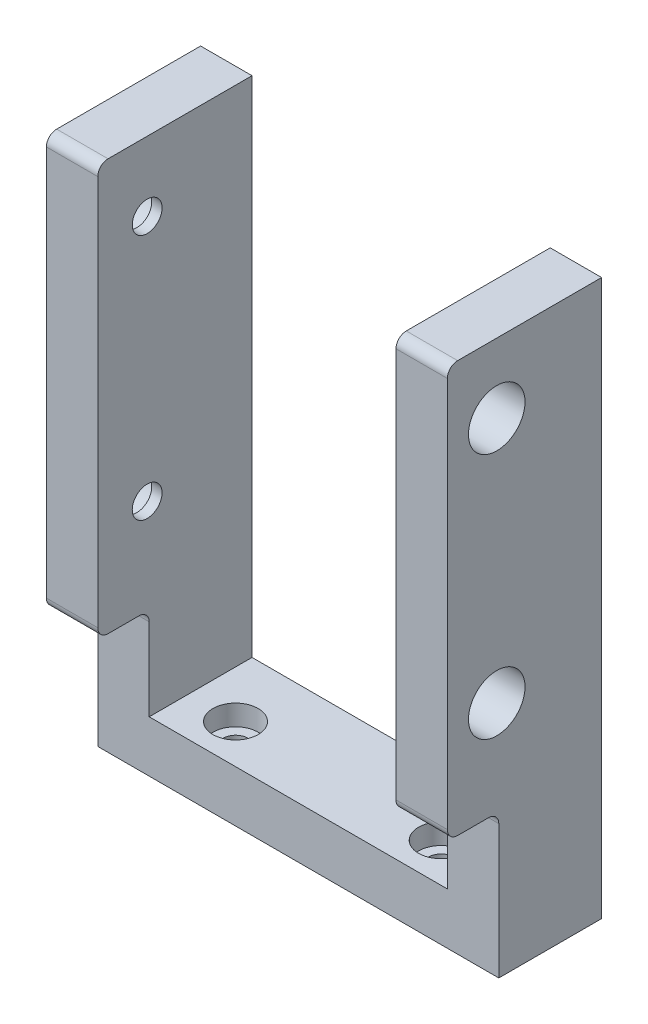
ISO-10303-21;
HEADER;
FILE_DESCRIPTION(('STEP AP214'),'2;1');
FILE_NAME('part.step','',(''),(''),'','','');
FILE_SCHEMA(('AUTOMOTIVE_DESIGN { 1 0 10303 214 1 1 1 1 }'));
ENDSEC;
DATA;
#1=APPLICATION_CONTEXT('core data for automotive mechanical design processes');
#2=APPLICATION_PROTOCOL_DEFINITION('international standard','automotive_design',2000,#1);
#3=PRODUCT_CONTEXT('',#1,'mechanical');
#4=PRODUCT('Part','Part','',(#3));
#5=PRODUCT_RELATED_PRODUCT_CATEGORY('part','',(#4));
#6=PRODUCT_DEFINITION_FORMATION('','',#4);
#7=PRODUCT_DEFINITION_CONTEXT('part definition',#1,'design');
#8=PRODUCT_DEFINITION('design','',#6,#7);
#9=PRODUCT_DEFINITION_SHAPE('','',#8);
#10=(LENGTH_UNIT() NAMED_UNIT(*) SI_UNIT(.MILLI.,.METRE.));
#11=(NAMED_UNIT(*) PLANE_ANGLE_UNIT() SI_UNIT($,.RADIAN.));
#12=(NAMED_UNIT(*) SI_UNIT($,.STERADIAN.) SOLID_ANGLE_UNIT());
#13=UNCERTAINTY_MEASURE_WITH_UNIT(LENGTH_MEASURE(1.E-05),#10,'distance_accuracy_value','');
#14=(GEOMETRIC_REPRESENTATION_CONTEXT(3) GLOBAL_UNCERTAINTY_ASSIGNED_CONTEXT((#13)) GLOBAL_UNIT_ASSIGNED_CONTEXT((#10,
#11,#12)) REPRESENTATION_CONTEXT('',''));
#15=CARTESIAN_POINT('',(0.,0.,0.));
#16=DIRECTION('',(0.,0.,1.));
#17=DIRECTION('',(1.,0.,0.));
#18=AXIS2_PLACEMENT_3D('',#15,#16,#17);
#19=CARTESIAN_POINT('',(34.,-5.,10.));
#20=DIRECTION('',(-1.,0.,0.));
#21=DIRECTION('',(0.,0.,1.));
#22=AXIS2_PLACEMENT_3D('',#19,#20,#21);
#23=PLANE('',#22);
#24=CARTESIAN_POINT('',(34.,42.250000000001,10.2000000000012));
#25=DIRECTION('',(1.,0.,0.));
#26=DIRECTION('',(0.,0.,-1.));
#27=AXIS2_PLACEMENT_3D('',#24,#25,#26);
#28=CIRCLE('',#27,2.75);
#29=CARTESIAN_POINT('',(34.,42.250000000001,7.45000000000116));
#30=VERTEX_POINT('',#29);
#31=EDGE_CURVE('E770',#30,#30,#28,.T.);
#32=ORIENTED_EDGE('',*,*,#31,.F.);
#33=EDGE_LOOP('',(#32));
#34=FACE_BOUND('',#33,.T.);
#35=DIRECTION('',(0.,-1.,0.));
#36=VECTOR('',#35,1.);
#37=CARTESIAN_POINT('',(34.,49.,15.));
#38=LINE('',#37,#36);
#39=CARTESIAN_POINT('',(34.,48.,15.));
#40=VERTEX_POINT('',#39);
#41=CARTESIAN_POINT('',(34.,9.99999999999999,15.));
#42=VERTEX_POINT('',#41);
#43=EDGE_CURVE('E320',#40,#42,#38,.T.);
#44=ORIENTED_EDGE('',*,*,#43,.T.);
#45=CARTESIAN_POINT('',(34.,9.99999999999999,14.));
#46=DIRECTION('',(-1.,0.,0.));
#47=DIRECTION('',(0.,0.,1.));
#48=AXIS2_PLACEMENT_3D('',#45,#46,#47);
#49=CIRCLE('',#48,1.);
#50=CARTESIAN_POINT('',(34.,8.99999999999999,14.));
#51=VERTEX_POINT('',#50);
#52=EDGE_CURVE('E215',#42,#51,#49,.F.);
#53=ORIENTED_EDGE('',*,*,#52,.T.);
#54=DIRECTION('',(0.,0.,-1.));
#55=VECTOR('',#54,1.);
#56=CARTESIAN_POINT('',(34.,8.99999999999999,15.));
#57=LINE('',#56,#55);
#58=CARTESIAN_POINT('',(34.,8.99999999999999,11.));
#59=VERTEX_POINT('',#58);
#60=EDGE_CURVE('E250',#51,#59,#57,.T.);
#61=ORIENTED_EDGE('',*,*,#60,.T.);
#62=CARTESIAN_POINT('',(34.,7.99999999999999,11.));
#63=DIRECTION('',(-1.,0.,0.));
#64=DIRECTION('',(0.,0.,1.));
#65=AXIS2_PLACEMENT_3D('',#62,#63,#64);
#66=CIRCLE('',#65,1.);
#67=CARTESIAN_POINT('',(34.,7.99999999999999,10.));
#68=VERTEX_POINT('',#67);
#69=EDGE_CURVE('E11',#59,#68,#66,.T.);
#70=ORIENTED_EDGE('',*,*,#69,.T.);
#71=DIRECTION('',(0.,1.,0.));
#72=VECTOR('',#71,1.);
#73=CARTESIAN_POINT('',(34.,-5.,10.));
#74=LINE('',#73,#72);
#75=CARTESIAN_POINT('',(34.,-5.,10.));
#76=VERTEX_POINT('',#75);
#77=EDGE_CURVE('E260',#76,#68,#74,.T.);
#78=ORIENTED_EDGE('',*,*,#77,.F.);
#79=DIRECTION('',(0.,0.,-1.));
#80=VECTOR('',#79,1.);
#81=CARTESIAN_POINT('',(34.,-5.,10.));
#82=LINE('',#81,#80);
#83=CARTESIAN_POINT('',(34.,-5.,0.));
#84=VERTEX_POINT('',#83);
#85=EDGE_CURVE('E293',#76,#84,#82,.T.);
#86=ORIENTED_EDGE('',*,*,#85,.T.);
#87=DIRECTION('',(0.,1.,0.));
#88=VECTOR('',#87,1.);
#89=CARTESIAN_POINT('',(34.,-5.,0.));
#90=LINE('',#89,#88);
#91=CARTESIAN_POINT('',(34.,49.,0.));
#92=VERTEX_POINT('',#91);
#93=EDGE_CURVE('E281',#84,#92,#90,.T.);
#94=ORIENTED_EDGE('',*,*,#93,.T.);
#95=DIRECTION('',(0.,0.,-1.));
#96=VECTOR('',#95,1.);
#97=CARTESIAN_POINT('',(34.,49.,10.));
#98=LINE('',#97,#96);
#99=CARTESIAN_POINT('',(34.,49.,14.));
#100=VERTEX_POINT('',#99);
#101=EDGE_CURVE('E291',#100,#92,#98,.T.);
#102=ORIENTED_EDGE('',*,*,#101,.F.);
#103=CARTESIAN_POINT('',(34.,48.,14.));
#104=DIRECTION('',(-1.,0.,0.));
#105=DIRECTION('',(0.,0.,1.));
#106=AXIS2_PLACEMENT_3D('',#103,#104,#105);
#107=CIRCLE('',#106,1.);
#108=EDGE_CURVE('E213',#100,#40,#107,.F.);
#109=ORIENTED_EDGE('',*,*,#108,.T.);
#110=EDGE_LOOP('',(#44,#53,#61,#70,#78,#86,#94,#102,#109));
#111=FACE_BOUND('',#110,.T.);
#112=CARTESIAN_POINT('',(34.,18.250000000001,10.2000000000012));
#113=DIRECTION('',(1.,0.,0.));
#114=DIRECTION('',(0.,0.,-1.));
#115=AXIS2_PLACEMENT_3D('',#112,#113,#114);
#116=CIRCLE('',#115,2.75);
#117=CARTESIAN_POINT('',(34.,18.250000000001,7.45000000000117));
#118=VERTEX_POINT('',#117);
#119=EDGE_CURVE('E760',#118,#118,#116,.T.);
#120=ORIENTED_EDGE('',*,*,#119,.F.);
#121=EDGE_LOOP('',(#120));
#122=FACE_BOUND('',#121,.T.);
#123=ADVANCED_FACE('F33',(#34,#111,#122),#23,.F.);
#124=CARTESIAN_POINT('',(0.,0.,10.));
#125=DIRECTION('',(0.,0.,-1.));
#126=DIRECTION('',(-1.,0.,0.));
#127=AXIS2_PLACEMENT_3D('',#124,#125,#126);
#128=PLANE('',#127);
#129=DIRECTION('',(0.,1.,0.));
#130=VECTOR('',#129,1.);
#131=CARTESIAN_POINT('',(0.,0.,10.));
#132=LINE('',#131,#130);
#133=CARTESIAN_POINT('',(0.,0.,10.));
#134=VERTEX_POINT('',#133);
#135=CARTESIAN_POINT('',(0.,7.99999999999999,10.));
#136=VERTEX_POINT('',#135);
#137=EDGE_CURVE('E157',#134,#136,#132,.T.);
#138=ORIENTED_EDGE('',*,*,#137,.T.);
#139=DIRECTION('',(1.,0.,0.));
#140=VECTOR('',#139,1.);
#141=CARTESIAN_POINT('',(-5.,7.99999999999999,10.));
#142=LINE('',#141,#140);
#143=CARTESIAN_POINT('',(-5.,7.99999999999999,10.));
#144=VERTEX_POINT('',#143);
#145=EDGE_CURVE('E198',#136,#144,#142,.F.);
#146=ORIENTED_EDGE('',*,*,#145,.T.);
#147=DIRECTION('',(0.,-1.,0.));
#148=VECTOR('',#147,1.);
#149=CARTESIAN_POINT('',(-5.,49.,10.));
#150=LINE('',#149,#148);
#151=CARTESIAN_POINT('',(-5.,-5.,10.));
#152=VERTEX_POINT('',#151);
#153=EDGE_CURVE('E169',#144,#152,#150,.T.);
#154=ORIENTED_EDGE('',*,*,#153,.T.);
#155=DIRECTION('',(1.,0.,0.));
#156=VECTOR('',#155,1.);
#157=CARTESIAN_POINT('',(-5.,-5.,10.));
#158=LINE('',#157,#156);
#159=EDGE_CURVE('E262',#152,#76,#158,.T.);
#160=ORIENTED_EDGE('',*,*,#159,.T.);
#161=ORIENTED_EDGE('',*,*,#77,.T.);
#162=DIRECTION('',(-1.,0.,0.));
#163=VECTOR('',#162,1.);
#164=CARTESIAN_POINT('',(0.,7.99999999999999,10.));
#165=LINE('',#164,#163);
#166=CARTESIAN_POINT('',(29.,7.99999999999999,10.));
#167=VERTEX_POINT('',#166);
#168=EDGE_CURVE('E196',#68,#167,#165,.T.);
#169=ORIENTED_EDGE('',*,*,#168,.T.);
#170=DIRECTION('',(0.,-1.,0.));
#171=VECTOR('',#170,1.);
#172=CARTESIAN_POINT('',(29.,49.,10.));
#173=LINE('',#172,#171);
#174=CARTESIAN_POINT('',(29.,0.,10.));
#175=VERTEX_POINT('',#174);
#176=EDGE_CURVE('E176',#167,#175,#173,.T.);
#177=ORIENTED_EDGE('',*,*,#176,.T.);
#178=DIRECTION('',(-1.,0.,0.));
#179=VECTOR('',#178,1.);
#180=CARTESIAN_POINT('',(29.,0.,10.));
#181=LINE('',#180,#179);
#182=EDGE_CURVE('E170',#175,#134,#181,.T.);
#183=ORIENTED_EDGE('',*,*,#182,.T.);
#184=EDGE_LOOP('',(#138,#146,#154,#160,#161,#169,#177,#183));
#185=FACE_BOUND('',#184,.T.);
#186=ADVANCED_FACE('F173',(#185),#128,.F.);
#187=CARTESIAN_POINT('',(29.,0.,10.));
#188=DIRECTION('',(0.,-1.,0.));
#189=DIRECTION('',(1.,0.,0.));
#190=AXIS2_PLACEMENT_3D('',#187,#188,#189);
#191=PLANE('',#190);
#192=CARTESIAN_POINT('',(24.595625560426,0.,6.2000000000436));
#193=DIRECTION('',(0.,1.,0.));
#194=DIRECTION('',(0.,0.,1.));
#195=AXIS2_PLACEMENT_3D('',#192,#193,#194);
#196=CIRCLE('',#195,2.2);
#197=CARTESIAN_POINT('',(24.595625560426,0.,8.4000000000436));
#198=VERTEX_POINT('',#197);
#199=EDGE_CURVE('E717',#198,#198,#196,.T.);
#200=ORIENTED_EDGE('',*,*,#199,.F.);
#201=EDGE_LOOP('',(#200));
#202=FACE_BOUND('',#201,.T.);
#203=CARTESIAN_POINT('',(4.59562556042595,0.,6.20000000004366));
#204=DIRECTION('',(0.,1.,0.));
#205=DIRECTION('',(0.,0.,1.));
#206=AXIS2_PLACEMENT_3D('',#203,#204,#205);
#207=CIRCLE('',#206,2.2);
#208=CARTESIAN_POINT('',(4.59562556042595,0.,8.40000000004366));
#209=VERTEX_POINT('',#208);
#210=EDGE_CURVE('E736',#209,#209,#207,.T.);
#211=ORIENTED_EDGE('',*,*,#210,.F.);
#212=EDGE_LOOP('',(#211));
#213=FACE_BOUND('',#212,.T.);
#214=DIRECTION('',(-1.,0.,0.));
#215=VECTOR('',#214,1.);
#216=CARTESIAN_POINT('',(29.,0.,0.));
#217=LINE('',#216,#215);
#218=CARTESIAN_POINT('',(29.,0.,0.));
#219=VERTEX_POINT('',#218);
#220=CARTESIAN_POINT('',(0.,0.,0.));
#221=VERTEX_POINT('',#220);
#222=EDGE_CURVE('E184',#219,#221,#217,.T.);
#223=ORIENTED_EDGE('',*,*,#222,.T.);
#224=DIRECTION('',(0.,0.,-1.));
#225=VECTOR('',#224,1.);
#226=CARTESIAN_POINT('',(0.,0.,10.));
#227=LINE('',#226,#225);
#228=EDGE_CURVE('E163',#134,#221,#227,.T.);
#229=ORIENTED_EDGE('',*,*,#228,.F.);
#230=ORIENTED_EDGE('',*,*,#182,.F.);
#231=DIRECTION('',(0.,0.,-1.));
#232=VECTOR('',#231,1.);
#233=CARTESIAN_POINT('',(29.,0.,10.));
#234=LINE('',#233,#232);
#235=EDGE_CURVE('E265',#175,#219,#234,.T.);
#236=ORIENTED_EDGE('',*,*,#235,.T.);
#237=EDGE_LOOP('',(#223,#229,#230,#236));
#238=FACE_BOUND('',#237,.T.);
#239=ADVANCED_FACE('F182',(#202,#213,#238),#191,.F.);
#240=CARTESIAN_POINT('',(0.,0.,10.));
#241=DIRECTION('',(-1.,0.,0.));
#242=DIRECTION('',(0.,0.,1.));
#243=AXIS2_PLACEMENT_3D('',#240,#241,#242);
#244=PLANE('',#243);
#245=CARTESIAN_POINT('',(0.,42.250000000001,10.2000000000012));
#246=DIRECTION('',(-1.,0.,0.));
#247=DIRECTION('',(0.,0.,1.));
#248=AXIS2_PLACEMENT_3D('',#245,#246,#247);
#249=CIRCLE('',#248,1.45);
#250=CARTESIAN_POINT('',(0.,42.250000000001,11.6500000000012));
#251=VERTEX_POINT('',#250);
#252=EDGE_CURVE('E785',#251,#251,#249,.T.);
#253=ORIENTED_EDGE('',*,*,#252,.T.);
#254=EDGE_LOOP('',(#253));
#255=FACE_BOUND('',#254,.T.);
#256=CARTESIAN_POINT('',(0.,18.250000000001,10.2000000000013));
#257=DIRECTION('',(-1.,0.,0.));
#258=DIRECTION('',(0.,0.,1.));
#259=AXIS2_PLACEMENT_3D('',#256,#257,#258);
#260=CIRCLE('',#259,1.45);
#261=CARTESIAN_POINT('',(0.,18.250000000001,11.6500000000013));
#262=VERTEX_POINT('',#261);
#263=EDGE_CURVE('E773',#262,#262,#260,.T.);
#264=ORIENTED_EDGE('',*,*,#263,.T.);
#265=EDGE_LOOP('',(#264));
#266=FACE_BOUND('',#265,.T.);
#267=DIRECTION('',(0.,1.,0.));
#268=VECTOR('',#267,1.);
#269=CARTESIAN_POINT('',(0.,49.,15.));
#270=LINE('',#269,#268);
#271=CARTESIAN_POINT('',(0.,9.99999999999999,15.));
#272=VERTEX_POINT('',#271);
#273=CARTESIAN_POINT('',(0.,48.,15.));
#274=VERTEX_POINT('',#273);
#275=EDGE_CURVE('E339',#272,#274,#270,.T.);
#276=ORIENTED_EDGE('',*,*,#275,.F.);
#277=CARTESIAN_POINT('',(0.,9.99999999999999,14.));
#278=DIRECTION('',(-1.,0.,0.));
#279=DIRECTION('',(0.,0.,1.));
#280=AXIS2_PLACEMENT_3D('',#277,#278,#279);
#281=CIRCLE('',#280,1.);
#282=CARTESIAN_POINT('',(0.,8.99999999999999,14.));
#283=VERTEX_POINT('',#282);
#284=EDGE_CURVE('E225',#272,#283,#281,.F.);
#285=ORIENTED_EDGE('',*,*,#284,.T.);
#286=DIRECTION('',(0.,0.,-1.));
#287=VECTOR('',#286,1.);
#288=CARTESIAN_POINT('',(0.,8.99999999999999,15.));
#289=LINE('',#288,#287);
#290=CARTESIAN_POINT('',(0.,8.99999999999999,11.));
#291=VERTEX_POINT('',#290);
#292=EDGE_CURVE('E342',#283,#291,#289,.T.);
#293=ORIENTED_EDGE('',*,*,#292,.T.);
#294=CARTESIAN_POINT('',(0.,7.99999999999999,11.));
#295=DIRECTION('',(-1.,0.,0.));
#296=DIRECTION('',(0.,0.,1.));
#297=AXIS2_PLACEMENT_3D('',#294,#295,#296);
#298=CIRCLE('',#297,1.);
#299=EDGE_CURVE('E166',#291,#136,#298,.T.);
#300=ORIENTED_EDGE('',*,*,#299,.T.);
#301=ORIENTED_EDGE('',*,*,#137,.F.);
#302=ORIENTED_EDGE('',*,*,#228,.T.);
#303=DIRECTION('',(0.,1.,0.));
#304=VECTOR('',#303,1.);
#305=CARTESIAN_POINT('',(0.,0.,0.));
#306=LINE('',#305,#304);
#307=CARTESIAN_POINT('',(0.,49.,0.));
#308=VERTEX_POINT('',#307);
#309=EDGE_CURVE('E271',#221,#308,#306,.T.);
#310=ORIENTED_EDGE('',*,*,#309,.T.);
#311=DIRECTION('',(0.,0.,-1.));
#312=VECTOR('',#311,1.);
#313=CARTESIAN_POINT('',(0.,49.,10.));
#314=LINE('',#313,#312);
#315=CARTESIAN_POINT('',(0.,49.,14.));
#316=VERTEX_POINT('',#315);
#317=EDGE_CURVE('E186',#316,#308,#314,.T.);
#318=ORIENTED_EDGE('',*,*,#317,.F.);
#319=CARTESIAN_POINT('',(0.,48.,14.));
#320=DIRECTION('',(-1.,0.,0.));
#321=DIRECTION('',(0.,0.,1.));
#322=AXIS2_PLACEMENT_3D('',#319,#320,#321);
#323=CIRCLE('',#322,1.);
#324=EDGE_CURVE('E223',#316,#274,#323,.F.);
#325=ORIENTED_EDGE('',*,*,#324,.T.);
#326=EDGE_LOOP('',(#276,#285,#293,#300,#301,#302,#310,#318,#325));
#327=FACE_BOUND('',#326,.T.);
#328=ADVANCED_FACE('F160',(#255,#266,#327),#244,.F.);
#329=CARTESIAN_POINT('',(0.,49.,10.));
#330=DIRECTION('',(0.,-1.,0.));
#331=DIRECTION('',(0.,0.,-1.));
#332=AXIS2_PLACEMENT_3D('',#329,#330,#331);
#333=PLANE('',#332);
#334=DIRECTION('',(0.,0.,-1.));
#335=VECTOR('',#334,1.);
#336=CARTESIAN_POINT('',(-5.,49.,10.));
#337=LINE('',#336,#335);
#338=CARTESIAN_POINT('',(-5.,49.,14.));
#339=VERTEX_POINT('',#338);
#340=CARTESIAN_POINT('',(-5.,49.,0.));
#341=VERTEX_POINT('',#340);
#342=EDGE_CURVE('E190',#339,#341,#337,.T.);
#343=ORIENTED_EDGE('',*,*,#342,.F.);
#344=DIRECTION('',(-1.,0.,0.));
#345=VECTOR('',#344,1.);
#346=CARTESIAN_POINT('',(0.,49.,14.));
#347=LINE('',#346,#345);
#348=EDGE_CURVE('E55',#339,#316,#347,.F.);
#349=ORIENTED_EDGE('',*,*,#348,.T.);
#350=ORIENTED_EDGE('',*,*,#317,.T.);
#351=DIRECTION('',(-1.,0.,0.));
#352=VECTOR('',#351,1.);
#353=CARTESIAN_POINT('',(0.,49.,0.));
#354=LINE('',#353,#352);
#355=EDGE_CURVE('E274',#308,#341,#354,.T.);
#356=ORIENTED_EDGE('',*,*,#355,.T.);
#357=EDGE_LOOP('',(#343,#349,#350,#356));
#358=FACE_BOUND('',#357,.T.);
#359=ADVANCED_FACE('F302',(#358),#333,.F.);
#360=CARTESIAN_POINT('',(-5.,49.,10.));
#361=DIRECTION('',(1.,0.,0.));
#362=DIRECTION('',(0.,1.,0.));
#363=AXIS2_PLACEMENT_3D('',#360,#361,#362);
#364=PLANE('',#363);
#365=CARTESIAN_POINT('',(-5.,42.250000000001,10.2000000000012));
#366=DIRECTION('',(-1.,0.,0.));
#367=DIRECTION('',(0.,0.,1.));
#368=AXIS2_PLACEMENT_3D('',#365,#366,#367);
#369=CIRCLE('',#368,2.75);
#370=CARTESIAN_POINT('',(-5.,42.250000000001,12.9500000000012));
#371=VERTEX_POINT('',#370);
#372=EDGE_CURVE('E794',#371,#371,#369,.T.);
#373=ORIENTED_EDGE('',*,*,#372,.F.);
#374=EDGE_LOOP('',(#373));
#375=FACE_BOUND('',#374,.T.);
#376=CARTESIAN_POINT('',(-5.,18.250000000001,10.2000000000013));
#377=DIRECTION('',(-1.,0.,0.));
#378=DIRECTION('',(0.,0.,1.));
#379=AXIS2_PLACEMENT_3D('',#376,#377,#378);
#380=CIRCLE('',#379,2.75);
#381=CARTESIAN_POINT('',(-5.,18.250000000001,12.9500000000012));
#382=VERTEX_POINT('',#381);
#383=EDGE_CURVE('E782',#382,#382,#380,.T.);
#384=ORIENTED_EDGE('',*,*,#383,.F.);
#385=EDGE_LOOP('',(#384));
#386=FACE_BOUND('',#385,.T.);
#387=DIRECTION('',(0.,0.,-1.));
#388=VECTOR('',#387,1.);
#389=CARTESIAN_POINT('',(-5.,8.99999999999999,15.));
#390=LINE('',#389,#388);
#391=CARTESIAN_POINT('',(-5.,8.99999999999999,14.));
#392=VERTEX_POINT('',#391);
#393=CARTESIAN_POINT('',(-5.,8.99999999999999,11.));
#394=VERTEX_POINT('',#393);
#395=EDGE_CURVE('E272',#392,#394,#390,.T.);
#396=ORIENTED_EDGE('',*,*,#395,.F.);
#397=CARTESIAN_POINT('',(-5.,9.99999999999999,14.));
#398=DIRECTION('',(1.,0.,0.));
#399=DIRECTION('',(0.,1.,0.));
#400=AXIS2_PLACEMENT_3D('',#397,#398,#399);
#401=CIRCLE('',#400,1.);
#402=CARTESIAN_POINT('',(-5.,9.99999999999999,15.));
#403=VERTEX_POINT('',#402);
#404=EDGE_CURVE('E228',#392,#403,#401,.F.);
#405=ORIENTED_EDGE('',*,*,#404,.T.);
#406=DIRECTION('',(0.,-1.,0.));
#407=VECTOR('',#406,1.);
#408=CARTESIAN_POINT('',(-5.,49.,15.));
#409=LINE('',#408,#407);
#410=CARTESIAN_POINT('',(-5.,48.,15.));
#411=VERTEX_POINT('',#410);
#412=EDGE_CURVE('E249',#411,#403,#409,.T.);
#413=ORIENTED_EDGE('',*,*,#412,.F.);
#414=CARTESIAN_POINT('',(-5.,48.,14.));
#415=DIRECTION('',(1.,0.,0.));
#416=DIRECTION('',(0.,1.,0.));
#417=AXIS2_PLACEMENT_3D('',#414,#415,#416);
#418=CIRCLE('',#417,1.);
#419=EDGE_CURVE('E48',#411,#339,#418,.F.);
#420=ORIENTED_EDGE('',*,*,#419,.T.);
#421=ORIENTED_EDGE('',*,*,#342,.T.);
#422=DIRECTION('',(0.,-1.,0.));
#423=VECTOR('',#422,1.);
#424=CARTESIAN_POINT('',(-5.,49.,0.));
#425=LINE('',#424,#423);
#426=CARTESIAN_POINT('',(-5.,-5.,0.));
#427=VERTEX_POINT('',#426);
#428=EDGE_CURVE('E277',#341,#427,#425,.T.);
#429=ORIENTED_EDGE('',*,*,#428,.T.);
#430=DIRECTION('',(0.,0.,-1.));
#431=VECTOR('',#430,1.);
#432=CARTESIAN_POINT('',(-5.,-5.,10.));
#433=LINE('',#432,#431);
#434=EDGE_CURVE('E295',#152,#427,#433,.T.);
#435=ORIENTED_EDGE('',*,*,#434,.F.);
#436=ORIENTED_EDGE('',*,*,#153,.F.);
#437=CARTESIAN_POINT('',(-5.,7.99999999999999,11.));
#438=DIRECTION('',(1.,0.,0.));
#439=DIRECTION('',(0.,1.,0.));
#440=AXIS2_PLACEMENT_3D('',#437,#438,#439);
#441=CIRCLE('',#440,1.);
#442=EDGE_CURVE('E235',#144,#394,#441,.T.);
#443=ORIENTED_EDGE('',*,*,#442,.T.);
#444=EDGE_LOOP('',(#396,#405,#413,#420,#421,#429,#435,#436,#443));
#445=FACE_BOUND('',#444,.T.);
#446=ADVANCED_FACE('F298',(#375,#386,#445),#364,.F.);
#447=CARTESIAN_POINT('',(-5.,-5.,10.));
#448=DIRECTION('',(0.,1.,0.));
#449=DIRECTION('',(-1.,0.,0.));
#450=AXIS2_PLACEMENT_3D('',#447,#448,#449);
#451=PLANE('',#450);
#452=CARTESIAN_POINT('',(24.595625560426,-5.,6.2000000000436));
#453=DIRECTION('',(0.,1.,0.));
#454=DIRECTION('',(-1.,0.,0.));
#455=AXIS2_PLACEMENT_3D('',#452,#453,#454);
#456=CIRCLE('',#455,1.2);
#457=CARTESIAN_POINT('',(23.395625560426,-5.,6.2000000000436));
#458=VERTEX_POINT('',#457);
#459=EDGE_CURVE('E733',#458,#458,#456,.T.);
#460=ORIENTED_EDGE('',*,*,#459,.T.);
#461=EDGE_LOOP('',(#460));
#462=FACE_BOUND('',#461,.T.);
#463=CARTESIAN_POINT('',(4.59562556042595,-5.,6.20000000004366));
#464=DIRECTION('',(0.,1.,0.));
#465=DIRECTION('',(-1.,0.,0.));
#466=AXIS2_PLACEMENT_3D('',#463,#464,#465);
#467=CIRCLE('',#466,1.2);
#468=CARTESIAN_POINT('',(3.39562556042596,-5.,6.20000000004366));
#469=VERTEX_POINT('',#468);
#470=EDGE_CURVE('E328',#469,#469,#467,.T.);
#471=ORIENTED_EDGE('',*,*,#470,.T.);
#472=EDGE_LOOP('',(#471));
#473=FACE_BOUND('',#472,.T.);
#474=DIRECTION('',(1.,0.,0.));
#475=VECTOR('',#474,1.);
#476=CARTESIAN_POINT('',(-5.,-5.,0.));
#477=LINE('',#476,#475);
#478=EDGE_CURVE('E279',#427,#84,#477,.T.);
#479=ORIENTED_EDGE('',*,*,#478,.T.);
#480=ORIENTED_EDGE('',*,*,#85,.F.);
#481=ORIENTED_EDGE('',*,*,#159,.F.);
#482=ORIENTED_EDGE('',*,*,#434,.T.);
#483=EDGE_LOOP('',(#479,#480,#481,#482));
#484=FACE_BOUND('',#483,.T.);
#485=ADVANCED_FACE('F309',(#462,#473,#484),#451,.F.);
#486=CARTESIAN_POINT('',(34.,49.,10.));
#487=DIRECTION('',(0.,-1.,0.));
#488=DIRECTION('',(0.,0.,-1.));
#489=AXIS2_PLACEMENT_3D('',#486,#487,#488);
#490=PLANE('',#489);
#491=DIRECTION('',(0.,0.,-1.));
#492=VECTOR('',#491,1.);
#493=CARTESIAN_POINT('',(29.,49.,10.));
#494=LINE('',#493,#492);
#495=CARTESIAN_POINT('',(29.,49.,14.));
#496=VERTEX_POINT('',#495);
#497=CARTESIAN_POINT('',(29.,49.,0.));
#498=VERTEX_POINT('',#497);
#499=EDGE_CURVE('E289',#496,#498,#494,.T.);
#500=ORIENTED_EDGE('',*,*,#499,.F.);
#501=DIRECTION('',(1.,0.,0.));
#502=VECTOR('',#501,1.);
#503=CARTESIAN_POINT('',(34.,49.,14.));
#504=LINE('',#503,#502);
#505=EDGE_CURVE('E231',#496,#100,#504,.T.);
#506=ORIENTED_EDGE('',*,*,#505,.T.);
#507=ORIENTED_EDGE('',*,*,#101,.T.);
#508=DIRECTION('',(-1.,0.,0.));
#509=VECTOR('',#508,1.);
#510=CARTESIAN_POINT('',(34.,49.,0.));
#511=LINE('',#510,#509);
#512=EDGE_CURVE('E284',#92,#498,#511,.T.);
#513=ORIENTED_EDGE('',*,*,#512,.T.);
#514=EDGE_LOOP('',(#500,#506,#507,#513));
#515=FACE_BOUND('',#514,.T.);
#516=ADVANCED_FACE('F314',(#515),#490,.F.);
#517=CARTESIAN_POINT('',(29.,49.,10.));
#518=DIRECTION('',(1.,0.,0.));
#519=DIRECTION('',(0.,1.,0.));
#520=AXIS2_PLACEMENT_3D('',#517,#518,#519);
#521=PLANE('',#520);
#522=CARTESIAN_POINT('',(29.,42.250000000001,10.2000000000012));
#523=DIRECTION('',(1.,0.,0.));
#524=DIRECTION('',(0.,1.,0.));
#525=AXIS2_PLACEMENT_3D('',#522,#523,#524);
#526=CIRCLE('',#525,1.45);
#527=CARTESIAN_POINT('',(29.,43.700000000001,10.2000000000012));
#528=VERTEX_POINT('',#527);
#529=EDGE_CURVE('E713',#528,#528,#526,.T.);
#530=ORIENTED_EDGE('',*,*,#529,.T.);
#531=EDGE_LOOP('',(#530));
#532=FACE_BOUND('',#531,.T.);
#533=CARTESIAN_POINT('',(29.,18.250000000001,10.2000000000012));
#534=DIRECTION('',(1.,0.,0.));
#535=DIRECTION('',(0.,1.,0.));
#536=AXIS2_PLACEMENT_3D('',#533,#534,#535);
#537=CIRCLE('',#536,1.45);
#538=CARTESIAN_POINT('',(29.,19.700000000001,10.2000000000012));
#539=VERTEX_POINT('',#538);
#540=EDGE_CURVE('E716',#539,#539,#537,.T.);
#541=ORIENTED_EDGE('',*,*,#540,.T.);
#542=EDGE_LOOP('',(#541));
#543=FACE_BOUND('',#542,.T.);
#544=DIRECTION('',(0.,0.,-1.));
#545=VECTOR('',#544,1.);
#546=CARTESIAN_POINT('',(29.,8.99999999999999,15.));
#547=LINE('',#546,#545);
#548=CARTESIAN_POINT('',(29.,8.99999999999999,14.));
#549=VERTEX_POINT('',#548);
#550=CARTESIAN_POINT('',(29.,8.99999999999999,11.));
#551=VERTEX_POINT('',#550);
#552=EDGE_CURVE('E240',#549,#551,#547,.T.);
#553=ORIENTED_EDGE('',*,*,#552,.F.);
#554=CARTESIAN_POINT('',(29.,9.99999999999999,14.));
#555=DIRECTION('',(1.,0.,0.));
#556=DIRECTION('',(0.,1.,0.));
#557=AXIS2_PLACEMENT_3D('',#554,#555,#556);
#558=CIRCLE('',#557,1.);
#559=CARTESIAN_POINT('',(29.,9.99999999999999,15.));
#560=VERTEX_POINT('',#559);
#561=EDGE_CURVE('E207',#549,#560,#558,.F.);
#562=ORIENTED_EDGE('',*,*,#561,.T.);
#563=DIRECTION('',(0.,1.,0.));
#564=VECTOR('',#563,1.);
#565=CARTESIAN_POINT('',(29.,49.,15.));
#566=LINE('',#565,#564);
#567=CARTESIAN_POINT('',(29.,48.,15.));
#568=VERTEX_POINT('',#567);
#569=EDGE_CURVE('E327',#560,#568,#566,.T.);
#570=ORIENTED_EDGE('',*,*,#569,.T.);
#571=CARTESIAN_POINT('',(29.,48.,14.));
#572=DIRECTION('',(1.,0.,0.));
#573=DIRECTION('',(0.,1.,0.));
#574=AXIS2_PLACEMENT_3D('',#571,#572,#573);
#575=CIRCLE('',#574,1.);
#576=EDGE_CURVE('E205',#568,#496,#575,.F.);
#577=ORIENTED_EDGE('',*,*,#576,.T.);
#578=ORIENTED_EDGE('',*,*,#499,.T.);
#579=DIRECTION('',(0.,-1.,0.));
#580=VECTOR('',#579,1.);
#581=CARTESIAN_POINT('',(29.,49.,0.));
#582=LINE('',#581,#580);
#583=EDGE_CURVE('E180',#498,#219,#582,.T.);
#584=ORIENTED_EDGE('',*,*,#583,.T.);
#585=ORIENTED_EDGE('',*,*,#235,.F.);
#586=ORIENTED_EDGE('',*,*,#176,.F.);
#587=CARTESIAN_POINT('',(29.,7.99999999999999,11.));
#588=DIRECTION('',(1.,0.,0.));
#589=DIRECTION('',(0.,1.,0.));
#590=AXIS2_PLACEMENT_3D('',#587,#588,#589);
#591=CIRCLE('',#590,1.);
#592=EDGE_CURVE('E41',#167,#551,#591,.T.);
#593=ORIENTED_EDGE('',*,*,#592,.T.);
#594=EDGE_LOOP('',(#553,#562,#570,#577,#578,#584,#585,#586,#593));
#595=FACE_BOUND('',#594,.T.);
#596=ADVANCED_FACE('F239',(#532,#543,#595),#521,.F.);
#597=CARTESIAN_POINT('',(0.,0.,0.));
#598=DIRECTION('',(0.,0.,-1.));
#599=DIRECTION('',(-1.,0.,0.));
#600=AXIS2_PLACEMENT_3D('',#597,#598,#599);
#601=PLANE('',#600);
#602=ORIENTED_EDGE('',*,*,#222,.F.);
#603=ORIENTED_EDGE('',*,*,#583,.F.);
#604=ORIENTED_EDGE('',*,*,#512,.F.);
#605=ORIENTED_EDGE('',*,*,#93,.F.);
#606=ORIENTED_EDGE('',*,*,#478,.F.);
#607=ORIENTED_EDGE('',*,*,#428,.F.);
#608=ORIENTED_EDGE('',*,*,#355,.F.);
#609=ORIENTED_EDGE('',*,*,#309,.F.);
#610=EDGE_LOOP('',(#602,#603,#604,#605,#606,#607,#608,#609));
#611=FACE_BOUND('',#610,.T.);
#612=ADVANCED_FACE('F305',(#611),#601,.T.);
#613=CARTESIAN_POINT('',(-5.,8.99999999999999,15.));
#614=DIRECTION('',(0.,1.,0.));
#615=DIRECTION('',(0.,0.,1.));
#616=AXIS2_PLACEMENT_3D('',#613,#614,#615);
#617=PLANE('',#616);
#618=ORIENTED_EDGE('',*,*,#395,.T.);
#619=DIRECTION('',(1.,0.,0.));
#620=VECTOR('',#619,1.);
#621=CARTESIAN_POINT('',(0.,8.99999999999999,11.));
#622=LINE('',#621,#620);
#623=EDGE_CURVE('E188',#394,#291,#622,.T.);
#624=ORIENTED_EDGE('',*,*,#623,.T.);
#625=ORIENTED_EDGE('',*,*,#292,.F.);
#626=DIRECTION('',(1.,0.,0.));
#627=VECTOR('',#626,1.);
#628=CARTESIAN_POINT('',(-5.,8.99999999999999,14.));
#629=LINE('',#628,#627);
#630=EDGE_CURVE('E185',#283,#392,#629,.F.);
#631=ORIENTED_EDGE('',*,*,#630,.T.);
#632=EDGE_LOOP('',(#618,#624,#625,#631));
#633=FACE_BOUND('',#632,.T.);
#634=ADVANCED_FACE('F352',(#633),#617,.F.);
#635=CARTESIAN_POINT('',(0.,0.,15.));
#636=DIRECTION('',(0.,0.,1.));
#637=DIRECTION('',(1.,0.,0.));
#638=AXIS2_PLACEMENT_3D('',#635,#636,#637);
#639=PLANE('',#638);
#640=ORIENTED_EDGE('',*,*,#412,.T.);
#641=DIRECTION('',(1.,0.,0.));
#642=VECTOR('',#641,1.);
#643=CARTESIAN_POINT('',(0.,9.99999999999999,15.));
#644=LINE('',#643,#642);
#645=EDGE_CURVE('E220',#403,#272,#644,.T.);
#646=ORIENTED_EDGE('',*,*,#645,.T.);
#647=ORIENTED_EDGE('',*,*,#275,.T.);
#648=DIRECTION('',(-1.,0.,0.));
#649=VECTOR('',#648,1.);
#650=CARTESIAN_POINT('',(-5.,48.,15.));
#651=LINE('',#650,#649);
#652=EDGE_CURVE('E217',#274,#411,#651,.T.);
#653=ORIENTED_EDGE('',*,*,#652,.T.);
#654=EDGE_LOOP('',(#640,#646,#647,#653));
#655=FACE_BOUND('',#654,.T.);
#656=ADVANCED_FACE('F359',(#655),#639,.T.);
#657=CARTESIAN_POINT('',(34.,8.99999999999999,15.));
#658=DIRECTION('',(0.,-1.,0.));
#659=DIRECTION('',(1.,0.,0.));
#660=AXIS2_PLACEMENT_3D('',#657,#658,#659);
#661=PLANE('',#660);
#662=ORIENTED_EDGE('',*,*,#552,.T.);
#663=DIRECTION('',(-1.,0.,0.));
#664=VECTOR('',#663,1.);
#665=CARTESIAN_POINT('',(34.,8.99999999999999,11.));
#666=LINE('',#665,#664);
#667=EDGE_CURVE('E203',#551,#59,#666,.F.);
#668=ORIENTED_EDGE('',*,*,#667,.T.);
#669=ORIENTED_EDGE('',*,*,#60,.F.);
#670=DIRECTION('',(-1.,0.,0.));
#671=VECTOR('',#670,1.);
#672=CARTESIAN_POINT('',(34.,8.99999999999999,14.));
#673=LINE('',#672,#671);
#674=EDGE_CURVE('E200',#51,#549,#673,.T.);
#675=ORIENTED_EDGE('',*,*,#674,.T.);
#676=EDGE_LOOP('',(#662,#668,#669,#675));
#677=FACE_BOUND('',#676,.T.);
#678=ADVANCED_FACE('F245',(#677),#661,.T.);
#679=CARTESIAN_POINT('',(29.,0.,15.));
#680=DIRECTION('',(0.,0.,1.));
#681=DIRECTION('',(-1.,0.,0.));
#682=AXIS2_PLACEMENT_3D('',#679,#680,#681);
#683=PLANE('',#682);
#684=ORIENTED_EDGE('',*,*,#569,.F.);
#685=DIRECTION('',(-1.,0.,0.));
#686=VECTOR('',#685,1.);
#687=CARTESIAN_POINT('',(29.,9.99999999999999,15.));
#688=LINE('',#687,#686);
#689=EDGE_CURVE('E211',#560,#42,#688,.F.);
#690=ORIENTED_EDGE('',*,*,#689,.T.);
#691=ORIENTED_EDGE('',*,*,#43,.F.);
#692=DIRECTION('',(1.,0.,0.));
#693=VECTOR('',#692,1.);
#694=CARTESIAN_POINT('',(29.,48.,15.));
#695=LINE('',#694,#693);
#696=EDGE_CURVE('E209',#40,#568,#695,.F.);
#697=ORIENTED_EDGE('',*,*,#696,.T.);
#698=EDGE_LOOP('',(#684,#690,#691,#697));
#699=FACE_BOUND('',#698,.T.);
#700=ADVANCED_FACE('F324',(#699),#683,.T.);
#701=CARTESIAN_POINT('',(4.59562556042595,0.,6.20000000004366));
#702=DIRECTION('',(0.,1.,0.));
#703=DIRECTION('',(0.,0.,1.));
#704=AXIS2_PLACEMENT_3D('',#701,#702,#703);
#705=CYLINDRICAL_SURFACE('',#704,1.2);
#706=ORIENTED_EDGE('',*,*,#470,.F.);
#707=EDGE_LOOP('',(#706));
#708=FACE_BOUND('',#707,.T.);
#709=CARTESIAN_POINT('',(4.59562556042595,-2.,6.20000000004366));
#710=DIRECTION('',(0.,1.,0.));
#711=DIRECTION('',(0.,0.,1.));
#712=AXIS2_PLACEMENT_3D('',#709,#710,#711);
#713=CIRCLE('',#712,1.2);
#714=CARTESIAN_POINT('',(4.59562556042595,-2.,7.40000000004366));
#715=VERTEX_POINT('',#714);
#716=EDGE_CURVE('E332',#715,#715,#713,.T.);
#717=ORIENTED_EDGE('',*,*,#716,.T.);
#718=EDGE_LOOP('',(#717));
#719=FACE_BOUND('',#718,.T.);
#720=ADVANCED_FACE('F596',(#708,#719),#705,.F.);
#721=CARTESIAN_POINT('',(5.79562556042595,-2.,6.20000000004366));
#722=DIRECTION('',(0.,-1.,0.));
#723=DIRECTION('',(0.,0.,-1.));
#724=AXIS2_PLACEMENT_3D('',#721,#722,#723);
#725=PLANE('',#724);
#726=ORIENTED_EDGE('',*,*,#716,.F.);
#727=EDGE_LOOP('',(#726));
#728=FACE_BOUND('',#727,.T.);
#729=CARTESIAN_POINT('',(4.59562556042595,-2.,6.20000000004366));
#730=DIRECTION('',(0.,1.,0.));
#731=DIRECTION('',(0.,0.,1.));
#732=AXIS2_PLACEMENT_3D('',#729,#730,#731);
#733=CIRCLE('',#732,2.2);
#734=CARTESIAN_POINT('',(4.59562556042595,-2.,8.40000000004366));
#735=VERTEX_POINT('',#734);
#736=EDGE_CURVE('E739',#735,#735,#733,.T.);
#737=ORIENTED_EDGE('',*,*,#736,.T.);
#738=EDGE_LOOP('',(#737));
#739=FACE_BOUND('',#738,.T.);
#740=ADVANCED_FACE('F587',(#728,#739),#725,.F.);
#741=CARTESIAN_POINT('',(4.59562556042595,0.,6.20000000004366));
#742=DIRECTION('',(0.,1.,0.));
#743=DIRECTION('',(0.,0.,1.));
#744=AXIS2_PLACEMENT_3D('',#741,#742,#743);
#745=CYLINDRICAL_SURFACE('',#744,2.2);
#746=ORIENTED_EDGE('',*,*,#736,.F.);
#747=EDGE_LOOP('',(#746));
#748=FACE_BOUND('',#747,.T.);
#749=ORIENTED_EDGE('',*,*,#210,.T.);
#750=EDGE_LOOP('',(#749));
#751=FACE_BOUND('',#750,.T.);
#752=ADVANCED_FACE('F578',(#748,#751),#745,.F.);
#753=CARTESIAN_POINT('',(24.595625560426,0.,6.2000000000436));
#754=DIRECTION('',(0.,1.,0.));
#755=DIRECTION('',(0.,0.,1.));
#756=AXIS2_PLACEMENT_3D('',#753,#754,#755);
#757=CYLINDRICAL_SURFACE('',#756,1.2);
#758=ORIENTED_EDGE('',*,*,#459,.F.);
#759=EDGE_LOOP('',(#758));
#760=FACE_BOUND('',#759,.T.);
#761=CARTESIAN_POINT('',(24.595625560426,-2.,6.2000000000436));
#762=DIRECTION('',(0.,1.,0.));
#763=DIRECTION('',(0.,0.,1.));
#764=AXIS2_PLACEMENT_3D('',#761,#762,#763);
#765=CIRCLE('',#764,1.2);
#766=CARTESIAN_POINT('',(24.595625560426,-2.,7.4000000000436));
#767=VERTEX_POINT('',#766);
#768=EDGE_CURVE('E730',#767,#767,#765,.T.);
#769=ORIENTED_EDGE('',*,*,#768,.T.);
#770=EDGE_LOOP('',(#769));
#771=FACE_BOUND('',#770,.T.);
#772=ADVANCED_FACE('F569',(#760,#771),#757,.F.);
#773=CARTESIAN_POINT('',(25.795625560426,-2.,6.2000000000436));
#774=DIRECTION('',(0.,-1.,0.));
#775=DIRECTION('',(0.,0.,-1.));
#776=AXIS2_PLACEMENT_3D('',#773,#774,#775);
#777=PLANE('',#776);
#778=ORIENTED_EDGE('',*,*,#768,.F.);
#779=EDGE_LOOP('',(#778));
#780=FACE_BOUND('',#779,.T.);
#781=CARTESIAN_POINT('',(24.595625560426,-2.,6.2000000000436));
#782=DIRECTION('',(0.,1.,0.));
#783=DIRECTION('',(0.,0.,1.));
#784=AXIS2_PLACEMENT_3D('',#781,#782,#783);
#785=CIRCLE('',#784,2.2);
#786=CARTESIAN_POINT('',(24.595625560426,-2.,8.4000000000436));
#787=VERTEX_POINT('',#786);
#788=EDGE_CURVE('E721',#787,#787,#785,.T.);
#789=ORIENTED_EDGE('',*,*,#788,.T.);
#790=EDGE_LOOP('',(#789));
#791=FACE_BOUND('',#790,.T.);
#792=ADVANCED_FACE('F560',(#780,#791),#777,.F.);
#793=CARTESIAN_POINT('',(24.595625560426,0.,6.2000000000436));
#794=DIRECTION('',(0.,1.,0.));
#795=DIRECTION('',(0.,0.,1.));
#796=AXIS2_PLACEMENT_3D('',#793,#794,#795);
#797=CYLINDRICAL_SURFACE('',#796,2.2);
#798=ORIENTED_EDGE('',*,*,#788,.F.);
#799=EDGE_LOOP('',(#798));
#800=FACE_BOUND('',#799,.T.);
#801=ORIENTED_EDGE('',*,*,#199,.T.);
#802=EDGE_LOOP('',(#801));
#803=FACE_BOUND('',#802,.T.);
#804=ADVANCED_FACE('F541',(#800,#803),#797,.F.);
#805=CARTESIAN_POINT('',(34.,18.250000000001,10.2000000000012));
#806=DIRECTION('',(1.,0.,0.));
#807=DIRECTION('',(0.,0.,-1.));
#808=AXIS2_PLACEMENT_3D('',#805,#806,#807);
#809=CYLINDRICAL_SURFACE('',#808,1.45);
#810=ORIENTED_EDGE('',*,*,#540,.F.);
#811=EDGE_LOOP('',(#810));
#812=FACE_BOUND('',#811,.T.);
#813=CARTESIAN_POINT('',(30.,18.250000000001,10.2000000000012));
#814=DIRECTION('',(1.,0.,0.));
#815=DIRECTION('',(0.,0.,-1.));
#816=AXIS2_PLACEMENT_3D('',#813,#814,#815);
#817=CIRCLE('',#816,1.45);
#818=CARTESIAN_POINT('',(30.,18.250000000001,8.75000000000117));
#819=VERTEX_POINT('',#818);
#820=EDGE_CURVE('E718',#819,#819,#817,.T.);
#821=ORIENTED_EDGE('',*,*,#820,.T.);
#822=EDGE_LOOP('',(#821));
#823=FACE_BOUND('',#822,.T.);
#824=ADVANCED_FACE('F533',(#812,#823),#809,.F.);
#825=CARTESIAN_POINT('',(30.,19.700000000001,10.2000000000012));
#826=DIRECTION('',(-1.,0.,0.));
#827=DIRECTION('',(0.,0.,1.));
#828=AXIS2_PLACEMENT_3D('',#825,#826,#827);
#829=PLANE('',#828);
#830=ORIENTED_EDGE('',*,*,#820,.F.);
#831=EDGE_LOOP('',(#830));
#832=FACE_BOUND('',#831,.T.);
#833=CARTESIAN_POINT('',(30.,18.250000000001,10.2000000000012));
#834=DIRECTION('',(1.,0.,0.));
#835=DIRECTION('',(0.,0.,-1.));
#836=AXIS2_PLACEMENT_3D('',#833,#834,#835);
#837=CIRCLE('',#836,2.75);
#838=CARTESIAN_POINT('',(30.,18.250000000001,7.45000000000117));
#839=VERTEX_POINT('',#838);
#840=EDGE_CURVE('E724',#839,#839,#837,.T.);
#841=ORIENTED_EDGE('',*,*,#840,.T.);
#842=EDGE_LOOP('',(#841));
#843=FACE_BOUND('',#842,.T.);
#844=ADVANCED_FACE('F524',(#832,#843),#829,.F.);
#845=CARTESIAN_POINT('',(34.,18.250000000001,10.2000000000012));
#846=DIRECTION('',(1.,0.,0.));
#847=DIRECTION('',(0.,0.,-1.));
#848=AXIS2_PLACEMENT_3D('',#845,#846,#847);
#849=CYLINDRICAL_SURFACE('',#848,2.75);
#850=ORIENTED_EDGE('',*,*,#840,.F.);
#851=EDGE_LOOP('',(#850));
#852=FACE_BOUND('',#851,.T.);
#853=ORIENTED_EDGE('',*,*,#119,.T.);
#854=EDGE_LOOP('',(#853));
#855=FACE_BOUND('',#854,.T.);
#856=ADVANCED_FACE('F515',(#852,#855),#849,.F.);
#857=CARTESIAN_POINT('',(34.,42.250000000001,10.2000000000012));
#858=DIRECTION('',(1.,0.,0.));
#859=DIRECTION('',(0.,0.,-1.));
#860=AXIS2_PLACEMENT_3D('',#857,#858,#859);
#861=CYLINDRICAL_SURFACE('',#860,1.45);
#862=ORIENTED_EDGE('',*,*,#529,.F.);
#863=EDGE_LOOP('',(#862));
#864=FACE_BOUND('',#863,.T.);
#865=CARTESIAN_POINT('',(30.,42.250000000001,10.2000000000012));
#866=DIRECTION('',(1.,0.,0.));
#867=DIRECTION('',(0.,0.,-1.));
#868=AXIS2_PLACEMENT_3D('',#865,#866,#867);
#869=CIRCLE('',#868,1.45);
#870=CARTESIAN_POINT('',(30.,42.250000000001,8.75000000000117));
#871=VERTEX_POINT('',#870);
#872=EDGE_CURVE('E764',#871,#871,#869,.T.);
#873=ORIENTED_EDGE('',*,*,#872,.T.);
#874=EDGE_LOOP('',(#873));
#875=FACE_BOUND('',#874,.T.);
#876=ADVANCED_FACE('F506',(#864,#875),#861,.F.);
#877=CARTESIAN_POINT('',(30.,43.700000000001,10.2000000000012));
#878=DIRECTION('',(-1.,0.,0.));
#879=DIRECTION('',(0.,0.,1.));
#880=AXIS2_PLACEMENT_3D('',#877,#878,#879);
#881=PLANE('',#880);
#882=ORIENTED_EDGE('',*,*,#872,.F.);
#883=EDGE_LOOP('',(#882));
#884=FACE_BOUND('',#883,.T.);
#885=CARTESIAN_POINT('',(30.,42.250000000001,10.2000000000012));
#886=DIRECTION('',(1.,0.,0.));
#887=DIRECTION('',(0.,0.,-1.));
#888=AXIS2_PLACEMENT_3D('',#885,#886,#887);
#889=CIRCLE('',#888,2.75);
#890=CARTESIAN_POINT('',(30.,42.250000000001,7.45000000000116));
#891=VERTEX_POINT('',#890);
#892=EDGE_CURVE('E767',#891,#891,#889,.T.);
#893=ORIENTED_EDGE('',*,*,#892,.T.);
#894=EDGE_LOOP('',(#893));
#895=FACE_BOUND('',#894,.T.);
#896=ADVANCED_FACE('F497',(#884,#895),#881,.F.);
#897=CARTESIAN_POINT('',(34.,42.250000000001,10.2000000000012));
#898=DIRECTION('',(1.,0.,0.));
#899=DIRECTION('',(0.,0.,-1.));
#900=AXIS2_PLACEMENT_3D('',#897,#898,#899);
#901=CYLINDRICAL_SURFACE('',#900,2.75);
#902=ORIENTED_EDGE('',*,*,#892,.F.);
#903=EDGE_LOOP('',(#902));
#904=FACE_BOUND('',#903,.T.);
#905=ORIENTED_EDGE('',*,*,#31,.T.);
#906=EDGE_LOOP('',(#905));
#907=FACE_BOUND('',#906,.T.);
#908=ADVANCED_FACE('F488',(#904,#907),#901,.F.);
#909=CARTESIAN_POINT('',(-5.,18.250000000001,10.2000000000013));
#910=DIRECTION('',(-1.,0.,0.));
#911=DIRECTION('',(0.,0.,1.));
#912=AXIS2_PLACEMENT_3D('',#909,#910,#911);
#913=CYLINDRICAL_SURFACE('',#912,1.45);
#914=ORIENTED_EDGE('',*,*,#263,.F.);
#915=EDGE_LOOP('',(#914));
#916=FACE_BOUND('',#915,.T.);
#917=CARTESIAN_POINT('',(-0.999999999999998,18.250000000001,10.2000000000013));
#918=DIRECTION('',(-1.,0.,0.));
#919=DIRECTION('',(0.,0.,1.));
#920=AXIS2_PLACEMENT_3D('',#917,#918,#919);
#921=CIRCLE('',#920,1.45);
#922=CARTESIAN_POINT('',(-0.999999999999998,18.250000000001,11.6500000000013));
#923=VERTEX_POINT('',#922);
#924=EDGE_CURVE('E776',#923,#923,#921,.T.);
#925=ORIENTED_EDGE('',*,*,#924,.T.);
#926=EDGE_LOOP('',(#925));
#927=FACE_BOUND('',#926,.T.);
#928=ADVANCED_FACE('F479',(#916,#927),#913,.F.);
#929=CARTESIAN_POINT('',(-0.999999999999998,19.700000000001,10.2000000000013));
#930=DIRECTION('',(1.,0.,0.));
#931=DIRECTION('',(0.,0.,-1.));
#932=AXIS2_PLACEMENT_3D('',#929,#930,#931);
#933=PLANE('',#932);
#934=ORIENTED_EDGE('',*,*,#924,.F.);
#935=EDGE_LOOP('',(#934));
#936=FACE_BOUND('',#935,.T.);
#937=CARTESIAN_POINT('',(-0.999999999999998,18.250000000001,10.2000000000013));
#938=DIRECTION('',(-1.,0.,0.));
#939=DIRECTION('',(0.,0.,1.));
#940=AXIS2_PLACEMENT_3D('',#937,#938,#939);
#941=CIRCLE('',#940,2.75);
#942=CARTESIAN_POINT('',(-0.999999999999998,18.250000000001,12.9500000000013));
#943=VERTEX_POINT('',#942);
#944=EDGE_CURVE('E779',#943,#943,#941,.T.);
#945=ORIENTED_EDGE('',*,*,#944,.T.);
#946=EDGE_LOOP('',(#945));
#947=FACE_BOUND('',#946,.T.);
#948=ADVANCED_FACE('F470',(#936,#947),#933,.F.);
#949=CARTESIAN_POINT('',(-5.,18.250000000001,10.2000000000013));
#950=DIRECTION('',(-1.,0.,0.));
#951=DIRECTION('',(0.,0.,1.));
#952=AXIS2_PLACEMENT_3D('',#949,#950,#951);
#953=CYLINDRICAL_SURFACE('',#952,2.75);
#954=ORIENTED_EDGE('',*,*,#944,.F.);
#955=EDGE_LOOP('',(#954));
#956=FACE_BOUND('',#955,.T.);
#957=ORIENTED_EDGE('',*,*,#383,.T.);
#958=EDGE_LOOP('',(#957));
#959=FACE_BOUND('',#958,.T.);
#960=ADVANCED_FACE('F461',(#956,#959),#953,.F.);
#961=CARTESIAN_POINT('',(-5.,42.250000000001,10.2000000000012));
#962=DIRECTION('',(-1.,0.,0.));
#963=DIRECTION('',(0.,0.,1.));
#964=AXIS2_PLACEMENT_3D('',#961,#962,#963);
#965=CYLINDRICAL_SURFACE('',#964,1.45);
#966=ORIENTED_EDGE('',*,*,#252,.F.);
#967=EDGE_LOOP('',(#966));
#968=FACE_BOUND('',#967,.T.);
#969=CARTESIAN_POINT('',(-0.999999999999999,42.250000000001,10.2000000000012));
#970=DIRECTION('',(-1.,0.,0.));
#971=DIRECTION('',(0.,0.,1.));
#972=AXIS2_PLACEMENT_3D('',#969,#970,#971);
#973=CIRCLE('',#972,1.45);
#974=CARTESIAN_POINT('',(-0.999999999999999,42.250000000001,11.6500000000012));
#975=VERTEX_POINT('',#974);
#976=EDGE_CURVE('E788',#975,#975,#973,.T.);
#977=ORIENTED_EDGE('',*,*,#976,.T.);
#978=EDGE_LOOP('',(#977));
#979=FACE_BOUND('',#978,.T.);
#980=ADVANCED_FACE('F452',(#968,#979),#965,.F.);
#981=CARTESIAN_POINT('',(-0.999999999999999,43.700000000001,10.2000000000012));
#982=DIRECTION('',(1.,0.,0.));
#983=DIRECTION('',(0.,0.,-1.));
#984=AXIS2_PLACEMENT_3D('',#981,#982,#983);
#985=PLANE('',#984);
#986=ORIENTED_EDGE('',*,*,#976,.F.);
#987=EDGE_LOOP('',(#986));
#988=FACE_BOUND('',#987,.T.);
#989=CARTESIAN_POINT('',(-0.999999999999999,42.250000000001,10.2000000000012));
#990=DIRECTION('',(-1.,0.,0.));
#991=DIRECTION('',(0.,0.,1.));
#992=AXIS2_PLACEMENT_3D('',#989,#990,#991);
#993=CIRCLE('',#992,2.75);
#994=CARTESIAN_POINT('',(-0.999999999999999,42.250000000001,12.9500000000012));
#995=VERTEX_POINT('',#994);
#996=EDGE_CURVE('E791',#995,#995,#993,.T.);
#997=ORIENTED_EDGE('',*,*,#996,.T.);
#998=EDGE_LOOP('',(#997));
#999=FACE_BOUND('',#998,.T.);
#1000=ADVANCED_FACE('F443',(#988,#999),#985,.F.);
#1001=CARTESIAN_POINT('',(-5.,42.250000000001,10.2000000000012));
#1002=DIRECTION('',(-1.,0.,0.));
#1003=DIRECTION('',(0.,0.,1.));
#1004=AXIS2_PLACEMENT_3D('',#1001,#1002,#1003);
#1005=CYLINDRICAL_SURFACE('',#1004,2.75);
#1006=ORIENTED_EDGE('',*,*,#996,.F.);
#1007=EDGE_LOOP('',(#1006));
#1008=FACE_BOUND('',#1007,.T.);
#1009=ORIENTED_EDGE('',*,*,#372,.T.);
#1010=EDGE_LOOP('',(#1009));
#1011=FACE_BOUND('',#1010,.T.);
#1012=ADVANCED_FACE('F399',(#1008,#1011),#1005,.F.);
#1013=CARTESIAN_POINT('',(-5.,7.99999999999999,11.));
#1014=DIRECTION('',(-1.,0.,0.));
#1015=DIRECTION('',(0.,0.,1.));
#1016=AXIS2_PLACEMENT_3D('',#1013,#1014,#1015);
#1017=CYLINDRICAL_SURFACE('',#1016,1.);
#1018=ORIENTED_EDGE('',*,*,#442,.F.);
#1019=ORIENTED_EDGE('',*,*,#145,.F.);
#1020=ORIENTED_EDGE('',*,*,#299,.F.);
#1021=ORIENTED_EDGE('',*,*,#623,.F.);
#1022=EDGE_LOOP('',(#1018,#1019,#1020,#1021));
#1023=FACE_BOUND('',#1022,.T.);
#1024=ADVANCED_FACE('F349',(#1023),#1017,.F.);
#1025=CARTESIAN_POINT('',(0.,7.99999999999999,11.));
#1026=DIRECTION('',(-1.,0.,0.));
#1027=DIRECTION('',(0.,-1.,0.));
#1028=AXIS2_PLACEMENT_3D('',#1025,#1026,#1027);
#1029=CYLINDRICAL_SURFACE('',#1028,1.);
#1030=ORIENTED_EDGE('',*,*,#69,.F.);
#1031=ORIENTED_EDGE('',*,*,#667,.F.);
#1032=ORIENTED_EDGE('',*,*,#592,.F.);
#1033=ORIENTED_EDGE('',*,*,#168,.F.);
#1034=EDGE_LOOP('',(#1030,#1031,#1032,#1033));
#1035=FACE_BOUND('',#1034,.T.);
#1036=ADVANCED_FACE('F253',(#1035),#1029,.F.);
#1037=CARTESIAN_POINT('',(34.,9.99999999999999,14.));
#1038=DIRECTION('',(-1.,0.,0.));
#1039=DIRECTION('',(0.,-1.,0.));
#1040=AXIS2_PLACEMENT_3D('',#1037,#1038,#1039);
#1041=CYLINDRICAL_SURFACE('',#1040,1.);
#1042=ORIENTED_EDGE('',*,*,#52,.F.);
#1043=ORIENTED_EDGE('',*,*,#689,.F.);
#1044=ORIENTED_EDGE('',*,*,#561,.F.);
#1045=ORIENTED_EDGE('',*,*,#674,.F.);
#1046=EDGE_LOOP('',(#1042,#1043,#1044,#1045));
#1047=FACE_BOUND('',#1046,.T.);
#1048=ADVANCED_FACE('F369',(#1047),#1041,.T.);
#1049=CARTESIAN_POINT('',(0.,9.99999999999999,14.));
#1050=DIRECTION('',(-1.,0.,0.));
#1051=DIRECTION('',(0.,0.,1.));
#1052=AXIS2_PLACEMENT_3D('',#1049,#1050,#1051);
#1053=CYLINDRICAL_SURFACE('',#1052,1.);
#1054=ORIENTED_EDGE('',*,*,#404,.F.);
#1055=ORIENTED_EDGE('',*,*,#630,.F.);
#1056=ORIENTED_EDGE('',*,*,#284,.F.);
#1057=ORIENTED_EDGE('',*,*,#645,.F.);
#1058=EDGE_LOOP('',(#1054,#1055,#1056,#1057));
#1059=FACE_BOUND('',#1058,.T.);
#1060=ADVANCED_FACE('F357',(#1059),#1053,.T.);
#1061=CARTESIAN_POINT('',(0.,48.,14.));
#1062=DIRECTION('',(1.,0.,0.));
#1063=DIRECTION('',(0.,0.,-1.));
#1064=AXIS2_PLACEMENT_3D('',#1061,#1062,#1063);
#1065=CYLINDRICAL_SURFACE('',#1064,1.);
#1066=ORIENTED_EDGE('',*,*,#324,.F.);
#1067=ORIENTED_EDGE('',*,*,#348,.F.);
#1068=ORIENTED_EDGE('',*,*,#419,.F.);
#1069=ORIENTED_EDGE('',*,*,#652,.F.);
#1070=EDGE_LOOP('',(#1066,#1067,#1068,#1069));
#1071=FACE_BOUND('',#1070,.T.);
#1072=ADVANCED_FACE('F363',(#1071),#1065,.T.);
#1073=CARTESIAN_POINT('',(34.,48.,14.));
#1074=DIRECTION('',(-1.,0.,0.));
#1075=DIRECTION('',(0.,0.,1.));
#1076=AXIS2_PLACEMENT_3D('',#1073,#1074,#1075);
#1077=CYLINDRICAL_SURFACE('',#1076,1.);
#1078=ORIENTED_EDGE('',*,*,#576,.F.);
#1079=ORIENTED_EDGE('',*,*,#696,.F.);
#1080=ORIENTED_EDGE('',*,*,#108,.F.);
#1081=ORIENTED_EDGE('',*,*,#505,.F.);
#1082=EDGE_LOOP('',(#1078,#1079,#1080,#1081));
#1083=FACE_BOUND('',#1082,.T.);
#1084=ADVANCED_FACE('F35',(#1083),#1077,.T.);
#1085=CLOSED_SHELL('',(#123,#186,#239,#328,#359,#446,#485,#516,#596,#612,#634,#656,#678,#700,
#720,#740,#752,#772,#792,#804,#824,#844,#856,#876,#896,#908,#928,#948,#960,#980,#1000,#1012,
#1024,#1036,#1048,#1060,#1072,#1084));
#1086=MANIFOLD_SOLID_BREP('B2',#1085);
#1087=ADVANCED_BREP_SHAPE_REPRESENTATION('',(#18,#1086),#14);
#1088=SHAPE_DEFINITION_REPRESENTATION(#9,#1087);
ENDSEC;
END-ISO-10303-21;
